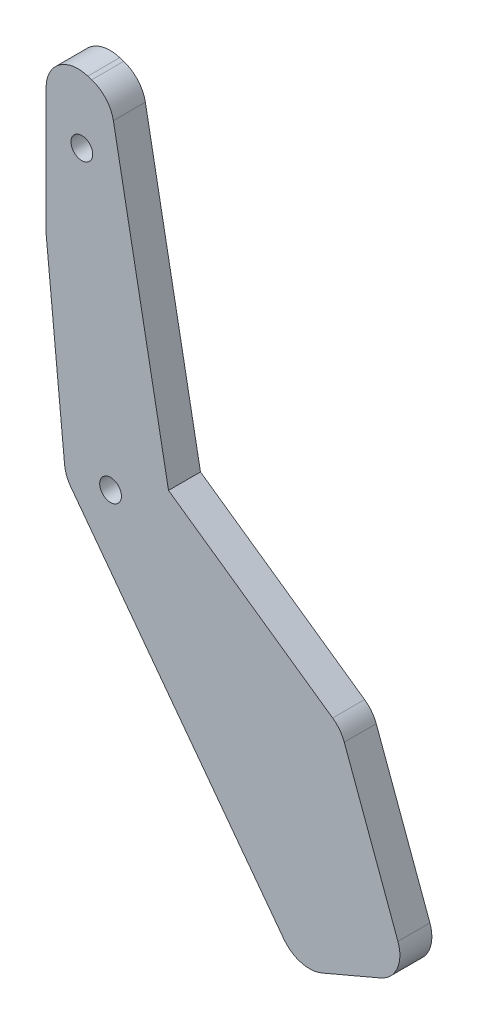
ISO-10303-21;
HEADER;
FILE_DESCRIPTION(('STEP AP214'),'2;1');
FILE_NAME('part.step','',(''),(''),'','','');
FILE_SCHEMA(('AUTOMOTIVE_DESIGN { 1 0 10303 214 1 1 1 1 }'));
ENDSEC;
DATA;
#1=APPLICATION_CONTEXT('core data for automotive mechanical design processes');
#2=APPLICATION_PROTOCOL_DEFINITION('international standard','automotive_design',2000,#1);
#3=PRODUCT_CONTEXT('',#1,'mechanical');
#4=PRODUCT('Part','Part','',(#3));
#5=PRODUCT_RELATED_PRODUCT_CATEGORY('part','',(#4));
#6=PRODUCT_DEFINITION_FORMATION('','',#4);
#7=PRODUCT_DEFINITION_CONTEXT('part definition',#1,'design');
#8=PRODUCT_DEFINITION('design','',#6,#7);
#9=PRODUCT_DEFINITION_SHAPE('','',#8);
#10=(LENGTH_UNIT() NAMED_UNIT(*) SI_UNIT(.MILLI.,.METRE.));
#11=(NAMED_UNIT(*) PLANE_ANGLE_UNIT() SI_UNIT($,.RADIAN.));
#12=(NAMED_UNIT(*) SI_UNIT($,.STERADIAN.) SOLID_ANGLE_UNIT());
#13=UNCERTAINTY_MEASURE_WITH_UNIT(LENGTH_MEASURE(1.E-05),#10,'distance_accuracy_value','');
#14=(GEOMETRIC_REPRESENTATION_CONTEXT(3) GLOBAL_UNCERTAINTY_ASSIGNED_CONTEXT((#13)) GLOBAL_UNIT_ASSIGNED_CONTEXT((#10,
#11,#12)) REPRESENTATION_CONTEXT('',''));
#15=CARTESIAN_POINT('',(0.,0.,0.));
#16=DIRECTION('',(0.,0.,1.));
#17=DIRECTION('',(1.,0.,0.));
#18=AXIS2_PLACEMENT_3D('',#15,#16,#17);
#19=CARTESIAN_POINT('',(17.4356570273699,-7.06806246269148,5.));
#20=DIRECTION('',(0.,0.,1.));
#21=DIRECTION('',(1.,0.,0.));
#22=AXIS2_PLACEMENT_3D('',#19,#20,#21);
#23=PLANE('',#22);
#24=CARTESIAN_POINT('',(15.1559218346645,36.6985156815101,5.));
#25=DIRECTION('',(0.,0.,1.));
#26=DIRECTION('',(1.,0.,0.));
#27=AXIS2_PLACEMENT_3D('',#24,#25,#26);
#28=CIRCLE('',#27,1.7);
#29=CARTESIAN_POINT('',(16.8559218346645,36.6985156815101,5.));
#30=VERTEX_POINT('',#29);
#31=EDGE_CURVE('E186',#30,#30,#28,.T.);
#32=ORIENTED_EDGE('',*,*,#31,.F.);
#33=EDGE_LOOP('',(#32));
#34=FACE_BOUND('',#33,.T.);
#35=DIRECTION('',(0.,-1.,0.));
#36=VECTOR('',#35,1.);
#37=CARTESIAN_POINT('',(9.5711316152296,42.1511795714276,5.));
#38=LINE('',#37,#36);
#39=CARTESIAN_POINT('',(9.5711316152296,42.1511795714276,5.));
#40=VERTEX_POINT('',#39);
#41=CARTESIAN_POINT('',(9.5711316152296,22.2906617881005,5.));
#42=VERTEX_POINT('',#41);
#43=EDGE_CURVE('E214',#40,#42,#38,.T.);
#44=ORIENTED_EDGE('',*,*,#43,.T.);
#45=DIRECTION('',(0.0963241948601906,-0.9953500135553,0.));
#46=VECTOR('',#45,1.);
#47=CARTESIAN_POINT('',(9.5711316152296,22.2906617881005,5.));
#48=LINE('',#47,#46);
#49=CARTESIAN_POINT('',(12.4589069595934,-7.54968343699242,5.));
#50=VERTEX_POINT('',#49);
#51=EDGE_CURVE('E123',#42,#50,#48,.T.);
#52=ORIENTED_EDGE('',*,*,#51,.T.);
#53=CARTESIAN_POINT('',(17.4356570273699,-7.06806246269148,5.));
#54=DIRECTION('',(0.,0.,1.));
#55=DIRECTION('',(1.,0.,0.));
#56=AXIS2_PLACEMENT_3D('',#53,#54,#55);
#57=CIRCLE('',#56,5.);
#58=CARTESIAN_POINT('',(13.4307079062137,-10.0614522697413,5.));
#59=VERTEX_POINT('',#58);
#60=EDGE_CURVE('E250',#50,#59,#57,.T.);
#61=ORIENTED_EDGE('',*,*,#60,.T.);
#62=DIRECTION('',(0.598677961409958,-0.800989824231255,0.));
#63=VECTOR('',#62,1.);
#64=CARTESIAN_POINT('',(13.4307079062137,-10.0614522697413,5.));
#65=LINE('',#64,#63);
#66=CARTESIAN_POINT('',(46.76276852904,-54.6574506202814,5.));
#67=VERTEX_POINT('',#66);
#68=EDGE_CURVE('E269',#59,#67,#65,.T.);
#69=ORIENTED_EDGE('',*,*,#68,.T.);
#70=CARTESIAN_POINT('',(50.7677176501963,-51.6640608132316,5.));
#71=DIRECTION('',(0.,0.,1.));
#72=DIRECTION('',(1.,0.,0.));
#73=AXIS2_PLACEMENT_3D('',#70,#71,#72);
#74=CIRCLE('',#73,5.);
#75=CARTESIAN_POINT('',(52.7291481269393,-56.2632771035254,5.));
#76=VERTEX_POINT('',#75);
#77=EDGE_CURVE('E266',#67,#76,#74,.T.);
#78=ORIENTED_EDGE('',*,*,#77,.T.);
#79=DIRECTION('',(0.919843258058761,0.39228609534859,0.));
#80=VECTOR('',#79,1.);
#81=CARTESIAN_POINT('',(52.7291481269393,-56.2632771035254,5.));
#82=LINE('',#81,#80);
#83=CARTESIAN_POINT('',(61.8680353739268,-52.3658104834866,5.));
#84=VERTEX_POINT('',#83);
#85=EDGE_CURVE('E268',#76,#84,#82,.T.);
#86=ORIENTED_EDGE('',*,*,#85,.T.);
#87=CARTESIAN_POINT('',(59.9066048971838,-47.7665941931928,5.));
#88=DIRECTION('',(0.,0.,1.));
#89=DIRECTION('',(1.,0.,0.));
#90=AXIS2_PLACEMENT_3D('',#87,#88,#89);
#91=CIRCLE('',#90,5.);
#92=CARTESIAN_POINT('',(64.5983204812694,-46.038067399056,5.));
#93=VERTEX_POINT('',#92);
#94=EDGE_CURVE('E271',#84,#93,#91,.T.);
#95=ORIENTED_EDGE('',*,*,#94,.T.);
#96=DIRECTION('',(-0.345705358827356,0.93834311681711,0.));
#97=VECTOR('',#96,1.);
#98=CARTESIAN_POINT('',(64.5983204812694,-46.038067399056,5.));
#99=LINE('',#98,#97);
#100=CARTESIAN_POINT('',(56.2044993934539,-23.2548387321282,5.));
#101=VERTEX_POINT('',#100);
#102=EDGE_CURVE('E277',#93,#101,#99,.T.);
#103=ORIENTED_EDGE('',*,*,#102,.T.);
#104=CARTESIAN_POINT('',(51.5127838093683,-24.983365526265,5.));
#105=DIRECTION('',(0.,0.,1.));
#106=DIRECTION('',(1.,0.,0.));
#107=AXIS2_PLACEMENT_3D('',#104,#105,#106);
#108=CIRCLE('',#107,5.);
#109=CARTESIAN_POINT('',(54.3826630922847,-20.889004415971,5.));
#110=VERTEX_POINT('',#109);
#111=EDGE_CURVE('E280',#101,#110,#108,.T.);
#112=ORIENTED_EDGE('',*,*,#111,.T.);
#113=DIRECTION('',(-0.818872222058794,0.573975856583266,0.));
#114=VECTOR('',#113,1.);
#115=CARTESIAN_POINT('',(54.3826630922847,-20.889004415971,5.));
#116=LINE('',#115,#114);
#117=CARTESIAN_POINT('',(28.7133948456888,-2.89652667303002,5.));
#118=VERTEX_POINT('',#117);
#119=EDGE_CURVE('E283',#110,#118,#116,.T.);
#120=ORIENTED_EDGE('',*,*,#119,.T.);
#121=DIRECTION('',(-0.185059056134634,0.982727401542543,0.));
#122=VECTOR('',#121,1.);
#123=CARTESIAN_POINT('',(28.7133948456888,-2.89652667303002,5.));
#124=LINE('',#123,#122);
#125=CARTESIAN_POINT('',(20.0926762403884,42.8824617827031,5.));
#126=VERTEX_POINT('',#125);
#127=EDGE_CURVE('E163',#118,#126,#124,.T.);
#128=ORIENTED_EDGE('',*,*,#127,.T.);
#129=CARTESIAN_POINT('',(15.1790392326757,41.9571665020299,5.));
#130=DIRECTION('',(0.,0.,1.));
#131=DIRECTION('',(1.,0.,0.));
#132=AXIS2_PLACEMENT_3D('',#129,#130,#131);
#133=CIRCLE('',#132,5.);
#134=CARTESIAN_POINT('',(16.6992401016417,46.7204625581234,5.));
#135=VERTEX_POINT('',#134);
#136=EDGE_CURVE('E157',#126,#135,#133,.T.);
#137=ORIENTED_EDGE('',*,*,#136,.T.);
#138=DIRECTION('',(-0.952659211218683,0.304040173793196,0.));
#139=VECTOR('',#138,1.);
#140=CARTESIAN_POINT('',(16.6992401016417,46.7204625581234,5.));
#141=LINE('',#140,#139);
#142=CARTESIAN_POINT('',(16.0913324841956,46.914475627521,5.));
#143=VERTEX_POINT('',#142);
#144=EDGE_CURVE('E161',#135,#143,#141,.T.);
#145=ORIENTED_EDGE('',*,*,#144,.T.);
#146=CARTESIAN_POINT('',(14.5711316152296,42.1511795714276,5.));
#147=DIRECTION('',(0.,0.,1.));
#148=DIRECTION('',(1.,0.,0.));
#149=AXIS2_PLACEMENT_3D('',#146,#147,#148);
#150=CIRCLE('',#149,5.);
#151=EDGE_CURVE('E57',#143,#40,#150,.T.);
#152=ORIENTED_EDGE('',*,*,#151,.T.);
#153=EDGE_LOOP('',(#44,#52,#61,#69,#78,#86,#95,#103,#112,#120,#128,#137,#145,#152));
#154=FACE_BOUND('',#153,.T.);
#155=CARTESIAN_POINT('',(19.6486571857202,-7.36411255481612,5.));
#156=DIRECTION('',(0.,0.,1.));
#157=DIRECTION('',(1.,0.,0.));
#158=AXIS2_PLACEMENT_3D('',#155,#156,#157);
#159=CIRCLE('',#158,1.7);
#160=CARTESIAN_POINT('',(21.3486571857202,-7.36411255481612,5.));
#161=VERTEX_POINT('',#160);
#162=EDGE_CURVE('E287',#161,#161,#159,.T.);
#163=ORIENTED_EDGE('',*,*,#162,.F.);
#164=EDGE_LOOP('',(#163));
#165=FACE_BOUND('',#164,.T.);
#166=ADVANCED_FACE('F39',(#34,#154,#165),#23,.T.);
#167=CARTESIAN_POINT('',(17.4356570273699,-7.06806246269148,0.));
#168=DIRECTION('',(0.,0.,1.));
#169=DIRECTION('',(1.,0.,0.));
#170=AXIS2_PLACEMENT_3D('',#167,#168,#169);
#171=PLANE('',#170);
#172=CARTESIAN_POINT('',(15.1559218346645,36.6985156815101,0.));
#173=DIRECTION('',(0.,0.,1.));
#174=DIRECTION('',(1.,0.,0.));
#175=AXIS2_PLACEMENT_3D('',#172,#173,#174);
#176=CIRCLE('',#175,1.7);
#177=CARTESIAN_POINT('',(16.8559218346645,36.6985156815101,0.));
#178=VERTEX_POINT('',#177);
#179=EDGE_CURVE('E290',#178,#178,#176,.T.);
#180=ORIENTED_EDGE('',*,*,#179,.T.);
#181=EDGE_LOOP('',(#180));
#182=FACE_BOUND('',#181,.T.);
#183=DIRECTION('',(0.,-1.,0.));
#184=VECTOR('',#183,1.);
#185=CARTESIAN_POINT('',(9.5711316152296,42.1511795714276,0.));
#186=LINE('',#185,#184);
#187=CARTESIAN_POINT('',(9.5711316152296,42.1511795714276,0.));
#188=VERTEX_POINT('',#187);
#189=CARTESIAN_POINT('',(9.5711316152296,22.2906617881005,0.));
#190=VERTEX_POINT('',#189);
#191=EDGE_CURVE('E181',#188,#190,#186,.T.);
#192=ORIENTED_EDGE('',*,*,#191,.F.);
#193=CARTESIAN_POINT('',(14.5711316152296,42.1511795714276,0.));
#194=DIRECTION('',(0.,0.,1.));
#195=DIRECTION('',(1.,0.,0.));
#196=AXIS2_PLACEMENT_3D('',#193,#194,#195);
#197=CIRCLE('',#196,5.);
#198=CARTESIAN_POINT('',(16.0913324841956,46.914475627521,0.));
#199=VERTEX_POINT('',#198);
#200=EDGE_CURVE('E114',#199,#188,#197,.T.);
#201=ORIENTED_EDGE('',*,*,#200,.F.);
#202=DIRECTION('',(-0.952659211218683,0.304040173793196,0.));
#203=VECTOR('',#202,1.);
#204=CARTESIAN_POINT('',(16.6992401016417,46.7204625581234,0.));
#205=LINE('',#204,#203);
#206=CARTESIAN_POINT('',(16.6992401016417,46.7204625581234,0.));
#207=VERTEX_POINT('',#206);
#208=EDGE_CURVE('E108',#207,#199,#205,.T.);
#209=ORIENTED_EDGE('',*,*,#208,.F.);
#210=CARTESIAN_POINT('',(15.1790392326757,41.9571665020299,0.));
#211=DIRECTION('',(0.,0.,1.));
#212=DIRECTION('',(1.,0.,0.));
#213=AXIS2_PLACEMENT_3D('',#210,#211,#212);
#214=CIRCLE('',#213,5.);
#215=CARTESIAN_POINT('',(20.0926762403884,42.8824617827031,0.));
#216=VERTEX_POINT('',#215);
#217=EDGE_CURVE('E171',#216,#207,#214,.T.);
#218=ORIENTED_EDGE('',*,*,#217,.F.);
#219=DIRECTION('',(-0.185059056134634,0.982727401542543,0.));
#220=VECTOR('',#219,1.);
#221=CARTESIAN_POINT('',(28.7133948456888,-2.89652667303002,0.));
#222=LINE('',#221,#220);
#223=CARTESIAN_POINT('',(28.7133948456888,-2.89652667303002,0.));
#224=VERTEX_POINT('',#223);
#225=EDGE_CURVE('E208',#224,#216,#222,.T.);
#226=ORIENTED_EDGE('',*,*,#225,.F.);
#227=DIRECTION('',(-0.818872222058794,0.573975856583266,0.));
#228=VECTOR('',#227,1.);
#229=CARTESIAN_POINT('',(54.3826630922847,-20.889004415971,0.));
#230=LINE('',#229,#228);
#231=CARTESIAN_POINT('',(54.3826630922847,-20.889004415971,0.));
#232=VERTEX_POINT('',#231);
#233=EDGE_CURVE('E205',#232,#224,#230,.T.);
#234=ORIENTED_EDGE('',*,*,#233,.F.);
#235=CARTESIAN_POINT('',(51.5127838093683,-24.983365526265,0.));
#236=DIRECTION('',(0.,0.,1.));
#237=DIRECTION('',(1.,0.,0.));
#238=AXIS2_PLACEMENT_3D('',#235,#236,#237);
#239=CIRCLE('',#238,5.);
#240=CARTESIAN_POINT('',(56.2044993934539,-23.2548387321282,0.));
#241=VERTEX_POINT('',#240);
#242=EDGE_CURVE('E202',#241,#232,#239,.T.);
#243=ORIENTED_EDGE('',*,*,#242,.F.);
#244=DIRECTION('',(-0.345705358827356,0.93834311681711,0.));
#245=VECTOR('',#244,1.);
#246=CARTESIAN_POINT('',(64.5983204812694,-46.038067399056,0.));
#247=LINE('',#246,#245);
#248=CARTESIAN_POINT('',(64.5983204812694,-46.038067399056,0.));
#249=VERTEX_POINT('',#248);
#250=EDGE_CURVE('E199',#249,#241,#247,.T.);
#251=ORIENTED_EDGE('',*,*,#250,.F.);
#252=CARTESIAN_POINT('',(59.9066048971838,-47.7665941931928,0.));
#253=DIRECTION('',(0.,0.,1.));
#254=DIRECTION('',(1.,0.,0.));
#255=AXIS2_PLACEMENT_3D('',#252,#253,#254);
#256=CIRCLE('',#255,5.);
#257=CARTESIAN_POINT('',(61.8680353739268,-52.3658104834866,0.));
#258=VERTEX_POINT('',#257);
#259=EDGE_CURVE('E197',#258,#249,#256,.T.);
#260=ORIENTED_EDGE('',*,*,#259,.F.);
#261=DIRECTION('',(0.919843258058761,0.39228609534859,0.));
#262=VECTOR('',#261,1.);
#263=CARTESIAN_POINT('',(52.7291481269393,-56.2632771035254,0.));
#264=LINE('',#263,#262);
#265=CARTESIAN_POINT('',(52.7291481269393,-56.2632771035254,0.));
#266=VERTEX_POINT('',#265);
#267=EDGE_CURVE('E195',#266,#258,#264,.T.);
#268=ORIENTED_EDGE('',*,*,#267,.F.);
#269=CARTESIAN_POINT('',(50.7677176501963,-51.6640608132316,0.));
#270=DIRECTION('',(0.,0.,1.));
#271=DIRECTION('',(1.,0.,0.));
#272=AXIS2_PLACEMENT_3D('',#269,#270,#271);
#273=CIRCLE('',#272,5.);
#274=CARTESIAN_POINT('',(46.76276852904,-54.6574506202814,0.));
#275=VERTEX_POINT('',#274);
#276=EDGE_CURVE('E193',#275,#266,#273,.T.);
#277=ORIENTED_EDGE('',*,*,#276,.F.);
#278=DIRECTION('',(0.598677961409958,-0.800989824231255,0.));
#279=VECTOR('',#278,1.);
#280=CARTESIAN_POINT('',(13.4307079062137,-10.0614522697413,0.));
#281=LINE('',#280,#279);
#282=CARTESIAN_POINT('',(13.4307079062137,-10.0614522697413,0.));
#283=VERTEX_POINT('',#282);
#284=EDGE_CURVE('E191',#283,#275,#281,.T.);
#285=ORIENTED_EDGE('',*,*,#284,.F.);
#286=CARTESIAN_POINT('',(17.4356570273699,-7.06806246269148,0.));
#287=DIRECTION('',(0.,0.,1.));
#288=DIRECTION('',(1.,0.,0.));
#289=AXIS2_PLACEMENT_3D('',#286,#287,#288);
#290=CIRCLE('',#289,5.);
#291=CARTESIAN_POINT('',(12.4589069595934,-7.54968343699242,0.));
#292=VERTEX_POINT('',#291);
#293=EDGE_CURVE('E189',#292,#283,#290,.T.);
#294=ORIENTED_EDGE('',*,*,#293,.F.);
#295=DIRECTION('',(0.0963241948601906,-0.9953500135553,0.));
#296=VECTOR('',#295,1.);
#297=CARTESIAN_POINT('',(9.5711316152296,22.2906617881005,0.));
#298=LINE('',#297,#296);
#299=EDGE_CURVE('E185',#190,#292,#298,.T.);
#300=ORIENTED_EDGE('',*,*,#299,.F.);
#301=EDGE_LOOP('',(#192,#201,#209,#218,#226,#234,#243,#251,#260,#268,#277,#285,#294,#300));
#302=FACE_BOUND('',#301,.T.);
#303=CARTESIAN_POINT('',(19.6486571857202,-7.36411255481612,0.));
#304=DIRECTION('',(0.,0.,1.));
#305=DIRECTION('',(1.,0.,0.));
#306=AXIS2_PLACEMENT_3D('',#303,#304,#305);
#307=CIRCLE('',#306,1.7);
#308=CARTESIAN_POINT('',(21.3486571857202,-7.36411255481612,0.));
#309=VERTEX_POINT('',#308);
#310=EDGE_CURVE('E291',#309,#309,#307,.T.);
#311=ORIENTED_EDGE('',*,*,#310,.T.);
#312=EDGE_LOOP('',(#311));
#313=FACE_BOUND('',#312,.T.);
#314=ADVANCED_FACE('F254',(#182,#302,#313),#171,.F.);
#315=CARTESIAN_POINT('',(9.5711316152296,42.1511795714276,5.));
#316=DIRECTION('',(1.,0.,0.));
#317=DIRECTION('',(0.,0.,-1.));
#318=AXIS2_PLACEMENT_3D('',#315,#316,#317);
#319=PLANE('',#318);
#320=ORIENTED_EDGE('',*,*,#191,.T.);
#321=DIRECTION('',(0.,0.,-1.));
#322=VECTOR('',#321,1.);
#323=CARTESIAN_POINT('',(9.5711316152296,22.2906617881005,5.));
#324=LINE('',#323,#322);
#325=EDGE_CURVE('E11',#42,#190,#324,.T.);
#326=ORIENTED_EDGE('',*,*,#325,.F.);
#327=ORIENTED_EDGE('',*,*,#43,.F.);
#328=DIRECTION('',(0.,0.,-1.));
#329=VECTOR('',#328,1.);
#330=CARTESIAN_POINT('',(9.5711316152296,42.1511795714276,5.));
#331=LINE('',#330,#329);
#332=EDGE_CURVE('E177',#40,#188,#331,.T.);
#333=ORIENTED_EDGE('',*,*,#332,.T.);
#334=EDGE_LOOP('',(#320,#326,#327,#333));
#335=FACE_BOUND('',#334,.T.);
#336=ADVANCED_FACE('F41',(#335),#319,.F.);
#337=CARTESIAN_POINT('',(9.5711316152296,22.2906617881005,5.));
#338=DIRECTION('',(0.9953500135553,0.0963241948601906,0.));
#339=DIRECTION('',(-0.0963241948601906,0.9953500135553,0.));
#340=AXIS2_PLACEMENT_3D('',#337,#338,#339);
#341=PLANE('',#340);
#342=ORIENTED_EDGE('',*,*,#299,.T.);
#343=DIRECTION('',(0.,0.,-1.));
#344=VECTOR('',#343,1.);
#345=CARTESIAN_POINT('',(12.4589069595934,-7.54968343699242,5.));
#346=LINE('',#345,#344);
#347=EDGE_CURVE('E49',#50,#292,#346,.T.);
#348=ORIENTED_EDGE('',*,*,#347,.F.);
#349=ORIENTED_EDGE('',*,*,#51,.F.);
#350=ORIENTED_EDGE('',*,*,#325,.T.);
#351=EDGE_LOOP('',(#342,#348,#349,#350));
#352=FACE_BOUND('',#351,.T.);
#353=ADVANCED_FACE('F310',(#352),#341,.F.);
#354=CARTESIAN_POINT('',(17.4356570273699,-7.06806246269148,5.));
#355=DIRECTION('',(0.,0.,-1.));
#356=DIRECTION('',(-1.,0.,0.));
#357=AXIS2_PLACEMENT_3D('',#354,#355,#356);
#358=CYLINDRICAL_SURFACE('',#357,5.);
#359=ORIENTED_EDGE('',*,*,#293,.T.);
#360=DIRECTION('',(0.,0.,-1.));
#361=VECTOR('',#360,1.);
#362=CARTESIAN_POINT('',(13.4307079062137,-10.0614522697413,5.));
#363=LINE('',#362,#361);
#364=EDGE_CURVE('E242',#59,#283,#363,.T.);
#365=ORIENTED_EDGE('',*,*,#364,.F.);
#366=ORIENTED_EDGE('',*,*,#60,.F.);
#367=ORIENTED_EDGE('',*,*,#347,.T.);
#368=EDGE_LOOP('',(#359,#365,#366,#367));
#369=FACE_BOUND('',#368,.T.);
#370=ADVANCED_FACE('F248',(#369),#358,.T.);
#371=CARTESIAN_POINT('',(13.4307079062137,-10.0614522697413,5.));
#372=DIRECTION('',(0.800989824231255,0.598677961409958,0.));
#373=DIRECTION('',(-0.598677961409958,0.800989824231255,0.));
#374=AXIS2_PLACEMENT_3D('',#371,#372,#373);
#375=PLANE('',#374);
#376=ORIENTED_EDGE('',*,*,#284,.T.);
#377=DIRECTION('',(0.,0.,-1.));
#378=VECTOR('',#377,1.);
#379=CARTESIAN_POINT('',(46.76276852904,-54.6574506202814,5.));
#380=LINE('',#379,#378);
#381=EDGE_CURVE('E239',#67,#275,#380,.T.);
#382=ORIENTED_EDGE('',*,*,#381,.F.);
#383=ORIENTED_EDGE('',*,*,#68,.F.);
#384=ORIENTED_EDGE('',*,*,#364,.T.);
#385=EDGE_LOOP('',(#376,#382,#383,#384));
#386=FACE_BOUND('',#385,.T.);
#387=ADVANCED_FACE('F260',(#386),#375,.F.);
#388=CARTESIAN_POINT('',(50.7677176501963,-51.6640608132316,5.));
#389=DIRECTION('',(0.,0.,-1.));
#390=DIRECTION('',(-1.,0.,0.));
#391=AXIS2_PLACEMENT_3D('',#388,#389,#390);
#392=CYLINDRICAL_SURFACE('',#391,5.);
#393=ORIENTED_EDGE('',*,*,#276,.T.);
#394=DIRECTION('',(0.,0.,-1.));
#395=VECTOR('',#394,1.);
#396=CARTESIAN_POINT('',(52.7291481269393,-56.2632771035254,5.));
#397=LINE('',#396,#395);
#398=EDGE_CURVE('E236',#76,#266,#397,.T.);
#399=ORIENTED_EDGE('',*,*,#398,.F.);
#400=ORIENTED_EDGE('',*,*,#77,.F.);
#401=ORIENTED_EDGE('',*,*,#381,.T.);
#402=EDGE_LOOP('',(#393,#399,#400,#401));
#403=FACE_BOUND('',#402,.T.);
#404=ADVANCED_FACE('F264',(#403),#392,.T.);
#405=CARTESIAN_POINT('',(52.7291481269393,-56.2632771035254,5.));
#406=DIRECTION('',(-0.39228609534859,0.919843258058761,0.));
#407=DIRECTION('',(-0.919843258058761,-0.39228609534859,0.));
#408=AXIS2_PLACEMENT_3D('',#405,#406,#407);
#409=PLANE('',#408);
#410=ORIENTED_EDGE('',*,*,#267,.T.);
#411=DIRECTION('',(0.,0.,-1.));
#412=VECTOR('',#411,1.);
#413=CARTESIAN_POINT('',(61.8680353739268,-52.3658104834866,5.));
#414=LINE('',#413,#412);
#415=EDGE_CURVE('E233',#84,#258,#414,.T.);
#416=ORIENTED_EDGE('',*,*,#415,.F.);
#417=ORIENTED_EDGE('',*,*,#85,.F.);
#418=ORIENTED_EDGE('',*,*,#398,.T.);
#419=EDGE_LOOP('',(#410,#416,#417,#418));
#420=FACE_BOUND('',#419,.T.);
#421=ADVANCED_FACE('F355',(#420),#409,.F.);
#422=CARTESIAN_POINT('',(59.9066048971838,-47.7665941931928,5.));
#423=DIRECTION('',(0.,0.,-1.));
#424=DIRECTION('',(-1.,0.,0.));
#425=AXIS2_PLACEMENT_3D('',#422,#423,#424);
#426=CYLINDRICAL_SURFACE('',#425,5.);
#427=ORIENTED_EDGE('',*,*,#259,.T.);
#428=DIRECTION('',(0.,0.,-1.));
#429=VECTOR('',#428,1.);
#430=CARTESIAN_POINT('',(64.5983204812694,-46.038067399056,5.));
#431=LINE('',#430,#429);
#432=EDGE_CURVE('E230',#93,#249,#431,.T.);
#433=ORIENTED_EDGE('',*,*,#432,.F.);
#434=ORIENTED_EDGE('',*,*,#94,.F.);
#435=ORIENTED_EDGE('',*,*,#415,.T.);
#436=EDGE_LOOP('',(#427,#433,#434,#435));
#437=FACE_BOUND('',#436,.T.);
#438=ADVANCED_FACE('F351',(#437),#426,.T.);
#439=CARTESIAN_POINT('',(64.5983204812694,-46.038067399056,5.));
#440=DIRECTION('',(-0.93834311681711,-0.345705358827356,0.));
#441=DIRECTION('',(0.345705358827356,-0.93834311681711,0.));
#442=AXIS2_PLACEMENT_3D('',#439,#440,#441);
#443=PLANE('',#442);
#444=ORIENTED_EDGE('',*,*,#250,.T.);
#445=DIRECTION('',(0.,0.,-1.));
#446=VECTOR('',#445,1.);
#447=CARTESIAN_POINT('',(56.2044993934539,-23.2548387321282,5.));
#448=LINE('',#447,#446);
#449=EDGE_CURVE('E226',#101,#241,#448,.T.);
#450=ORIENTED_EDGE('',*,*,#449,.F.);
#451=ORIENTED_EDGE('',*,*,#102,.F.);
#452=ORIENTED_EDGE('',*,*,#432,.T.);
#453=EDGE_LOOP('',(#444,#450,#451,#452));
#454=FACE_BOUND('',#453,.T.);
#455=ADVANCED_FACE('F347',(#454),#443,.F.);
#456=CARTESIAN_POINT('',(51.5127838093683,-24.983365526265,5.));
#457=DIRECTION('',(0.,0.,-1.));
#458=DIRECTION('',(-1.,0.,0.));
#459=AXIS2_PLACEMENT_3D('',#456,#457,#458);
#460=CYLINDRICAL_SURFACE('',#459,5.);
#461=ORIENTED_EDGE('',*,*,#242,.T.);
#462=DIRECTION('',(0.,0.,-1.));
#463=VECTOR('',#462,1.);
#464=CARTESIAN_POINT('',(54.3826630922847,-20.889004415971,5.));
#465=LINE('',#464,#463);
#466=EDGE_CURVE('E222',#110,#232,#465,.T.);
#467=ORIENTED_EDGE('',*,*,#466,.F.);
#468=ORIENTED_EDGE('',*,*,#111,.F.);
#469=ORIENTED_EDGE('',*,*,#449,.T.);
#470=EDGE_LOOP('',(#461,#467,#468,#469));
#471=FACE_BOUND('',#470,.T.);
#472=ADVANCED_FACE('F343',(#471),#460,.T.);
#473=CARTESIAN_POINT('',(54.3826630922847,-20.889004415971,5.));
#474=DIRECTION('',(-0.573975856583266,-0.818872222058794,0.));
#475=DIRECTION('',(0.818872222058794,-0.573975856583266,0.));
#476=AXIS2_PLACEMENT_3D('',#473,#474,#475);
#477=PLANE('',#476);
#478=ORIENTED_EDGE('',*,*,#233,.T.);
#479=DIRECTION('',(0.,0.,-1.));
#480=VECTOR('',#479,1.);
#481=CARTESIAN_POINT('',(28.7133948456888,-2.89652667303002,5.));
#482=LINE('',#481,#480);
#483=EDGE_CURVE('E218',#118,#224,#482,.T.);
#484=ORIENTED_EDGE('',*,*,#483,.F.);
#485=ORIENTED_EDGE('',*,*,#119,.F.);
#486=ORIENTED_EDGE('',*,*,#466,.T.);
#487=EDGE_LOOP('',(#478,#484,#485,#486));
#488=FACE_BOUND('',#487,.T.);
#489=ADVANCED_FACE('F339',(#488),#477,.F.);
#490=CARTESIAN_POINT('',(28.7133948456888,-2.89652667303002,5.));
#491=DIRECTION('',(-0.982727401542543,-0.185059056134634,0.));
#492=DIRECTION('',(0.185059056134634,-0.982727401542543,0.));
#493=AXIS2_PLACEMENT_3D('',#490,#491,#492);
#494=PLANE('',#493);
#495=ORIENTED_EDGE('',*,*,#225,.T.);
#496=DIRECTION('',(0.,0.,-1.));
#497=VECTOR('',#496,1.);
#498=CARTESIAN_POINT('',(20.0926762403884,42.8824617827031,5.));
#499=LINE('',#498,#497);
#500=EDGE_CURVE('E172',#126,#216,#499,.T.);
#501=ORIENTED_EDGE('',*,*,#500,.F.);
#502=ORIENTED_EDGE('',*,*,#127,.F.);
#503=ORIENTED_EDGE('',*,*,#483,.T.);
#504=EDGE_LOOP('',(#495,#501,#502,#503));
#505=FACE_BOUND('',#504,.T.);
#506=ADVANCED_FACE('F336',(#505),#494,.F.);
#507=CARTESIAN_POINT('',(15.1790392326757,41.9571665020299,5.));
#508=DIRECTION('',(0.,0.,-1.));
#509=DIRECTION('',(-1.,0.,0.));
#510=AXIS2_PLACEMENT_3D('',#507,#508,#509);
#511=CYLINDRICAL_SURFACE('',#510,5.);
#512=ORIENTED_EDGE('',*,*,#217,.T.);
#513=DIRECTION('',(0.,0.,-1.));
#514=VECTOR('',#513,1.);
#515=CARTESIAN_POINT('',(16.6992401016417,46.7204625581234,5.));
#516=LINE('',#515,#514);
#517=EDGE_CURVE('E168',#135,#207,#516,.T.);
#518=ORIENTED_EDGE('',*,*,#517,.F.);
#519=ORIENTED_EDGE('',*,*,#136,.F.);
#520=ORIENTED_EDGE('',*,*,#500,.T.);
#521=EDGE_LOOP('',(#512,#518,#519,#520));
#522=FACE_BOUND('',#521,.T.);
#523=ADVANCED_FACE('F169',(#522),#511,.T.);
#524=CARTESIAN_POINT('',(16.6992401016417,46.7204625581234,5.));
#525=DIRECTION('',(-0.304040173793196,-0.952659211218683,0.));
#526=DIRECTION('',(0.952659211218683,-0.304040173793196,0.));
#527=AXIS2_PLACEMENT_3D('',#524,#525,#526);
#528=PLANE('',#527);
#529=ORIENTED_EDGE('',*,*,#208,.T.);
#530=DIRECTION('',(0.,0.,-1.));
#531=VECTOR('',#530,1.);
#532=CARTESIAN_POINT('',(16.0913324841956,46.914475627521,5.));
#533=LINE('',#532,#531);
#534=EDGE_CURVE('E173',#143,#199,#533,.T.);
#535=ORIENTED_EDGE('',*,*,#534,.F.);
#536=ORIENTED_EDGE('',*,*,#144,.F.);
#537=ORIENTED_EDGE('',*,*,#517,.T.);
#538=EDGE_LOOP('',(#529,#535,#536,#537));
#539=FACE_BOUND('',#538,.T.);
#540=ADVANCED_FACE('F175',(#539),#528,.F.);
#541=CARTESIAN_POINT('',(14.5711316152296,42.1511795714276,5.));
#542=DIRECTION('',(0.,0.,-1.));
#543=DIRECTION('',(-1.,0.,0.));
#544=AXIS2_PLACEMENT_3D('',#541,#542,#543);
#545=CYLINDRICAL_SURFACE('',#544,5.);
#546=ORIENTED_EDGE('',*,*,#200,.T.);
#547=ORIENTED_EDGE('',*,*,#332,.F.);
#548=ORIENTED_EDGE('',*,*,#151,.F.);
#549=ORIENTED_EDGE('',*,*,#534,.T.);
#550=EDGE_LOOP('',(#546,#547,#548,#549));
#551=FACE_BOUND('',#550,.T.);
#552=ADVANCED_FACE('F329',(#551),#545,.T.);
#553=CARTESIAN_POINT('',(15.1559218346645,36.6985156815101,5.));
#554=DIRECTION('',(0.,0.,-1.));
#555=DIRECTION('',(-1.,0.,0.));
#556=AXIS2_PLACEMENT_3D('',#553,#554,#555);
#557=CYLINDRICAL_SURFACE('',#556,1.7);
#558=ORIENTED_EDGE('',*,*,#31,.T.);
#559=EDGE_LOOP('',(#558));
#560=FACE_BOUND('',#559,.T.);
#561=ORIENTED_EDGE('',*,*,#179,.F.);
#562=EDGE_LOOP('',(#561));
#563=FACE_BOUND('',#562,.T.);
#564=ADVANCED_FACE('F326',(#560,#563),#557,.F.);
#565=CARTESIAN_POINT('',(19.6486571857202,-7.36411255481612,5.));
#566=DIRECTION('',(0.,0.,-1.));
#567=DIRECTION('',(-1.,0.,0.));
#568=AXIS2_PLACEMENT_3D('',#565,#566,#567);
#569=CYLINDRICAL_SURFACE('',#568,1.7);
#570=ORIENTED_EDGE('',*,*,#162,.T.);
#571=EDGE_LOOP('',(#570));
#572=FACE_BOUND('',#571,.T.);
#573=ORIENTED_EDGE('',*,*,#310,.F.);
#574=EDGE_LOOP('',(#573));
#575=FACE_BOUND('',#574,.T.);
#576=ADVANCED_FACE('F413',(#572,#575),#569,.F.);
#577=CLOSED_SHELL('',(#166,#314,#336,#353,#370,#387,#404,#421,#438,#455,#472,#489,#506,#523,
#540,#552,#564,#576));
#578=MANIFOLD_SOLID_BREP('B2',#577);
#579=ADVANCED_BREP_SHAPE_REPRESENTATION('',(#18,#578),#14);
#580=SHAPE_DEFINITION_REPRESENTATION(#9,#579);
ENDSEC;
END-ISO-10303-21;
